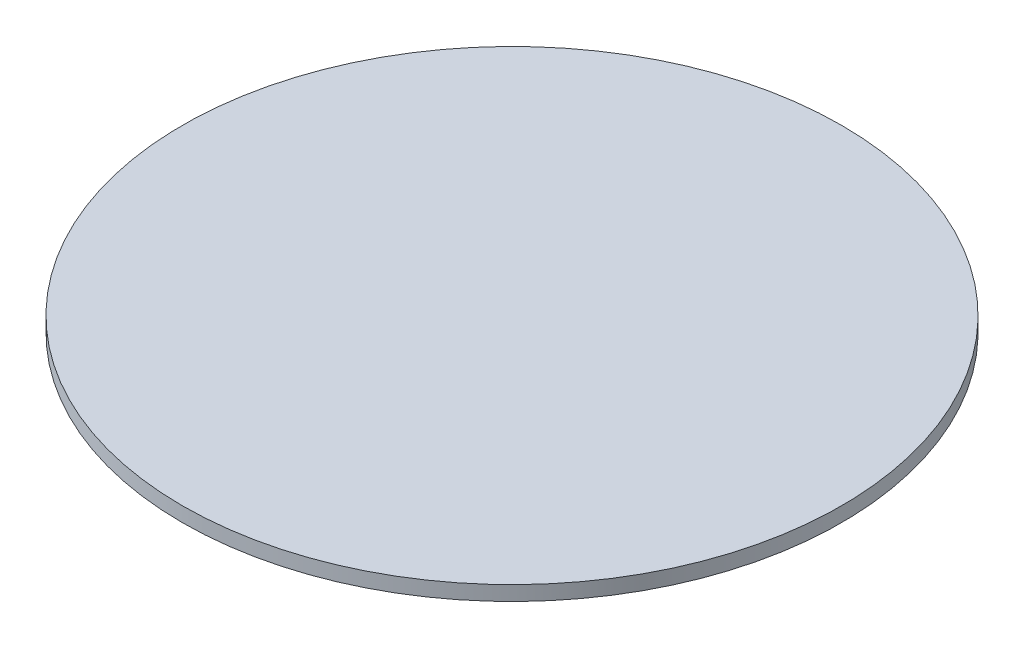
ISO-10303-21;
HEADER;
FILE_DESCRIPTION(('STEP AP214'),'2;1');
FILE_NAME('part.step','',(''),(''),'','','');
FILE_SCHEMA(('AUTOMOTIVE_DESIGN { 1 0 10303 214 1 1 1 1 }'));
ENDSEC;
DATA;
#1=APPLICATION_CONTEXT('core data for automotive mechanical design processes');
#2=APPLICATION_PROTOCOL_DEFINITION('international standard','automotive_design',2000,#1);
#3=PRODUCT_CONTEXT('',#1,'mechanical');
#4=PRODUCT('Part','Part','',(#3));
#5=PRODUCT_RELATED_PRODUCT_CATEGORY('part','',(#4));
#6=PRODUCT_DEFINITION_FORMATION('','',#4);
#7=PRODUCT_DEFINITION_CONTEXT('part definition',#1,'design');
#8=PRODUCT_DEFINITION('design','',#6,#7);
#9=PRODUCT_DEFINITION_SHAPE('','',#8);
#10=(LENGTH_UNIT() NAMED_UNIT(*) SI_UNIT(.MILLI.,.METRE.));
#11=(NAMED_UNIT(*) PLANE_ANGLE_UNIT() SI_UNIT($,.RADIAN.));
#12=(NAMED_UNIT(*) SI_UNIT($,.STERADIAN.) SOLID_ANGLE_UNIT());
#13=UNCERTAINTY_MEASURE_WITH_UNIT(LENGTH_MEASURE(1.E-05),#10,'distance_accuracy_value','');
#14=(GEOMETRIC_REPRESENTATION_CONTEXT(3) GLOBAL_UNCERTAINTY_ASSIGNED_CONTEXT((#13)) GLOBAL_UNIT_ASSIGNED_CONTEXT((#10,
#11,#12)) REPRESENTATION_CONTEXT('',''));
#15=CARTESIAN_POINT('',(0.,0.,0.));
#16=DIRECTION('',(0.,0.,1.));
#17=DIRECTION('',(1.,0.,0.));
#18=AXIS2_PLACEMENT_3D('',#15,#16,#17);
#19=CARTESIAN_POINT('',(0.,4.,0.));
#20=DIRECTION('',(0.,-1.,0.));
#21=DIRECTION('',(0.,0.,-1.));
#22=AXIS2_PLACEMENT_3D('',#19,#20,#21);
#23=CYLINDRICAL_SURFACE('',#22,90.);
#24=CARTESIAN_POINT('',(0.,4.,0.));
#25=DIRECTION('',(0.,1.,0.));
#26=DIRECTION('',(0.,0.,1.));
#27=AXIS2_PLACEMENT_3D('',#24,#25,#26);
#28=CIRCLE('',#27,90.);
#29=CARTESIAN_POINT('',(0.,4.,90.));
#30=VERTEX_POINT('',#29);
#31=EDGE_CURVE('E10',#30,#30,#28,.T.);
#32=ORIENTED_EDGE('',*,*,#31,.F.);
#33=EDGE_LOOP('',(#32));
#34=FACE_BOUND('',#33,.T.);
#35=CARTESIAN_POINT('',(0.,0.,0.));
#36=DIRECTION('',(0.,1.,0.));
#37=DIRECTION('',(0.,0.,1.));
#38=AXIS2_PLACEMENT_3D('',#35,#36,#37);
#39=CIRCLE('',#38,90.);
#40=CARTESIAN_POINT('',(0.,0.,90.));
#41=VERTEX_POINT('',#40);
#42=EDGE_CURVE('E34',#41,#41,#39,.T.);
#43=ORIENTED_EDGE('',*,*,#42,.T.);
#44=EDGE_LOOP('',(#43));
#45=FACE_BOUND('',#44,.T.);
#46=ADVANCED_FACE('F31',(#34,#45),#23,.T.);
#47=CARTESIAN_POINT('',(0.,4.,0.));
#48=DIRECTION('',(0.,1.,0.));
#49=DIRECTION('',(0.,0.,1.));
#50=AXIS2_PLACEMENT_3D('',#47,#48,#49);
#51=PLANE('',#50);
#52=ORIENTED_EDGE('',*,*,#31,.T.);
#53=EDGE_LOOP('',(#52));
#54=FACE_BOUND('',#53,.T.);
#55=ADVANCED_FACE('F46',(#54),#51,.T.);
#56=CARTESIAN_POINT('',(0.,0.,0.));
#57=DIRECTION('',(0.,1.,0.));
#58=DIRECTION('',(0.,0.,1.));
#59=AXIS2_PLACEMENT_3D('',#56,#57,#58);
#60=PLANE('',#59);
#61=ORIENTED_EDGE('',*,*,#42,.F.);
#62=EDGE_LOOP('',(#61));
#63=FACE_BOUND('',#62,.T.);
#64=ADVANCED_FACE('F44',(#63),#60,.F.);
#65=CLOSED_SHELL('',(#46,#55,#64));
#66=MANIFOLD_SOLID_BREP('B2',#65);
#67=ADVANCED_BREP_SHAPE_REPRESENTATION('',(#18,#66),#14);
#68=SHAPE_DEFINITION_REPRESENTATION(#9,#67);
ENDSEC;
END-ISO-10303-21;
